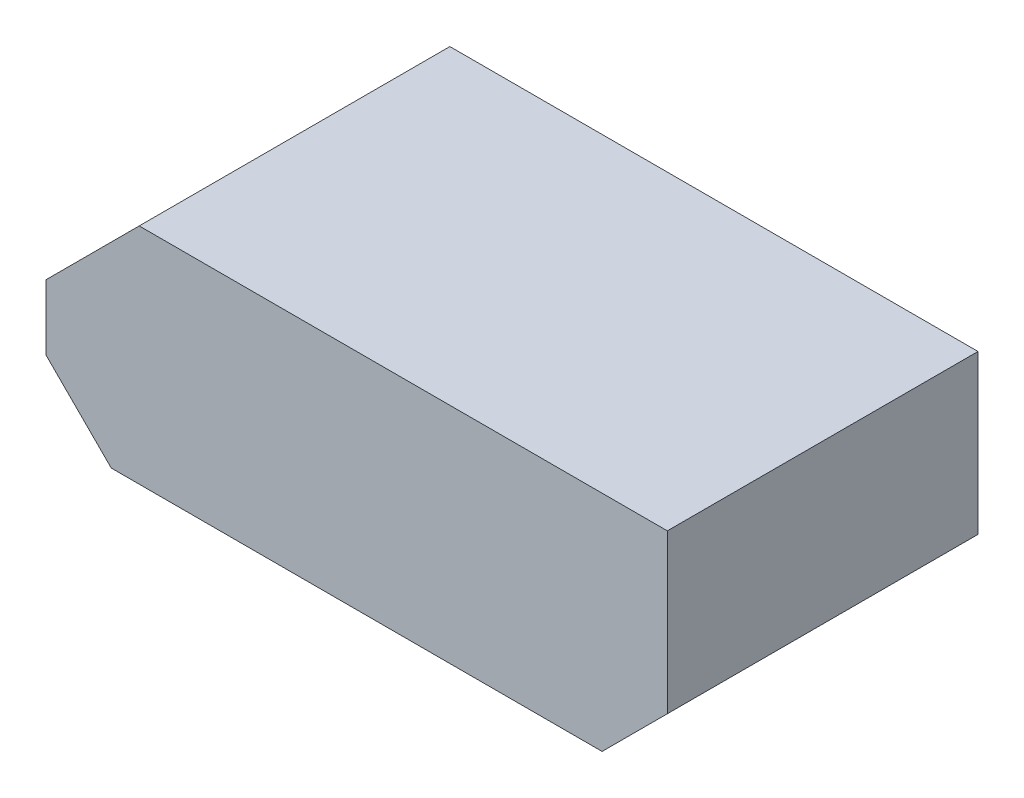
ISO-10303-21;
HEADER;
FILE_DESCRIPTION(('STEP AP214'),'2;1');
FILE_NAME('part.step','',(''),(''),'','','');
FILE_SCHEMA(('AUTOMOTIVE_DESIGN { 1 0 10303 214 1 1 1 1 }'));
ENDSEC;
DATA;
#1=APPLICATION_CONTEXT('core data for automotive mechanical design processes');
#2=APPLICATION_PROTOCOL_DEFINITION('international standard','automotive_design',2000,#1);
#3=PRODUCT_CONTEXT('',#1,'mechanical');
#4=PRODUCT('Part','Part','',(#3));
#5=PRODUCT_RELATED_PRODUCT_CATEGORY('part','',(#4));
#6=PRODUCT_DEFINITION_FORMATION('','',#4);
#7=PRODUCT_DEFINITION_CONTEXT('part definition',#1,'design');
#8=PRODUCT_DEFINITION('design','',#6,#7);
#9=PRODUCT_DEFINITION_SHAPE('','',#8);
#10=(LENGTH_UNIT() NAMED_UNIT(*) SI_UNIT(.MILLI.,.METRE.));
#11=(NAMED_UNIT(*) PLANE_ANGLE_UNIT() SI_UNIT($,.RADIAN.));
#12=(NAMED_UNIT(*) SI_UNIT($,.STERADIAN.) SOLID_ANGLE_UNIT());
#13=UNCERTAINTY_MEASURE_WITH_UNIT(LENGTH_MEASURE(1.E-05),#10,'distance_accuracy_value','');
#14=(GEOMETRIC_REPRESENTATION_CONTEXT(3) GLOBAL_UNCERTAINTY_ASSIGNED_CONTEXT((#13)) GLOBAL_UNIT_ASSIGNED_CONTEXT((#10,
#11,#12)) REPRESENTATION_CONTEXT('',''));
#15=CARTESIAN_POINT('',(0.,0.,0.));
#16=DIRECTION('',(0.,0.,1.));
#17=DIRECTION('',(1.,0.,0.));
#18=AXIS2_PLACEMENT_3D('',#15,#16,#17);
#19=CARTESIAN_POINT('',(628.969744525669,-699.597339454556,500.));
#20=DIRECTION('',(0.707106781186554,-0.707106781186541,0.));
#21=DIRECTION('',(0.707106781186541,0.707106781186554,0.));
#22=AXIS2_PLACEMENT_3D('',#19,#20,#21);
#23=PLANE('',#22);
#24=DIRECTION('',(-0.707106781186541,-0.707106781186554,0.));
#25=VECTOR('',#24,1.);
#26=CARTESIAN_POINT('',(628.969744525669,-699.597339454556,0.));
#27=LINE('',#26,#25);
#28=CARTESIAN_POINT('',(1254.88292822101,-73.6841557591998,0.));
#29=VERTEX_POINT('',#28);
#30=CARTESIAN_POINT('',(1149.88292822101,-178.6841557592,0.));
#31=VERTEX_POINT('',#30);
#32=EDGE_CURVE('E121',#29,#31,#27,.T.);
#33=ORIENTED_EDGE('',*,*,#32,.F.);
#34=DIRECTION('',(0.,0.,-1.));
#35=VECTOR('',#34,1.);
#36=CARTESIAN_POINT('',(1254.88292822101,-73.6841557591998,500.));
#37=LINE('',#36,#35);
#38=CARTESIAN_POINT('',(1254.88292822101,-73.6841557591998,500.));
#39=VERTEX_POINT('',#38);
#40=EDGE_CURVE('E11',#39,#29,#37,.T.);
#41=ORIENTED_EDGE('',*,*,#40,.F.);
#42=DIRECTION('',(-0.707106781186541,-0.707106781186554,0.));
#43=VECTOR('',#42,1.);
#44=CARTESIAN_POINT('',(628.969744525669,-699.597339454556,500.));
#45=LINE('',#44,#43);
#46=CARTESIAN_POINT('',(1149.88292822101,-178.6841557592,500.));
#47=VERTEX_POINT('',#46);
#48=EDGE_CURVE('E136',#39,#47,#45,.T.);
#49=ORIENTED_EDGE('',*,*,#48,.T.);
#50=DIRECTION('',(0.,0.,-1.));
#51=VECTOR('',#50,1.);
#52=CARTESIAN_POINT('',(1149.88292822101,-178.6841557592,500.));
#53=LINE('',#52,#51);
#54=EDGE_CURVE('E83',#47,#31,#53,.T.);
#55=ORIENTED_EDGE('',*,*,#54,.T.);
#56=EDGE_LOOP('',(#33,#41,#49,#55));
#57=FACE_BOUND('',#56,.T.);
#58=ADVANCED_FACE('F35',(#57),#23,.T.);
#59=CARTESIAN_POINT('',(1254.88292822101,-825.510523149898,500.));
#60=DIRECTION('',(-1.,0.,0.));
#61=DIRECTION('',(0.,0.,1.));
#62=AXIS2_PLACEMENT_3D('',#59,#60,#61);
#63=PLANE('',#62);
#64=DIRECTION('',(0.,1.,0.));
#65=VECTOR('',#64,1.);
#66=CARTESIAN_POINT('',(1254.88292822101,-825.510523149898,0.));
#67=LINE('',#66,#65);
#68=CARTESIAN_POINT('',(1254.88292822101,181.3158442408,0.));
#69=VERTEX_POINT('',#68);
#70=EDGE_CURVE('E124',#29,#69,#67,.T.);
#71=ORIENTED_EDGE('',*,*,#70,.T.);
#72=DIRECTION('',(0.,0.,-1.));
#73=VECTOR('',#72,1.);
#74=CARTESIAN_POINT('',(1254.88292822101,181.3158442408,500.));
#75=LINE('',#74,#73);
#76=CARTESIAN_POINT('',(1254.88292822101,181.3158442408,500.));
#77=VERTEX_POINT('',#76);
#78=EDGE_CURVE('E43',#77,#69,#75,.T.);
#79=ORIENTED_EDGE('',*,*,#78,.F.);
#80=DIRECTION('',(0.,1.,0.));
#81=VECTOR('',#80,1.);
#82=CARTESIAN_POINT('',(1254.88292822101,-825.510523149898,500.));
#83=LINE('',#82,#81);
#84=EDGE_CURVE('E156',#39,#77,#83,.T.);
#85=ORIENTED_EDGE('',*,*,#84,.F.);
#86=ORIENTED_EDGE('',*,*,#40,.T.);
#87=EDGE_LOOP('',(#71,#79,#85,#86));
#88=FACE_BOUND('',#87,.T.);
#89=ADVANCED_FACE('F160',(#88),#63,.F.);
#90=CARTESIAN_POINT('',(754.882928221013,181.3158442408,500.));
#91=DIRECTION('',(0.,-1.,0.));
#92=DIRECTION('',(1.,0.,0.));
#93=AXIS2_PLACEMENT_3D('',#90,#91,#92);
#94=PLANE('',#93);
#95=DIRECTION('',(-1.,0.,0.));
#96=VECTOR('',#95,1.);
#97=CARTESIAN_POINT('',(754.882928221013,181.3158442408,0.));
#98=LINE('',#97,#96);
#99=CARTESIAN_POINT('',(404.882928221013,181.3158442408,0.));
#100=VERTEX_POINT('',#99);
#101=EDGE_CURVE('E126',#69,#100,#98,.T.);
#102=ORIENTED_EDGE('',*,*,#101,.T.);
#103=DIRECTION('',(0.,0.,-1.));
#104=VECTOR('',#103,1.);
#105=CARTESIAN_POINT('',(404.882928221013,181.3158442408,500.));
#106=LINE('',#105,#104);
#107=CARTESIAN_POINT('',(404.882928221013,181.3158442408,500.));
#108=VERTEX_POINT('',#107);
#109=EDGE_CURVE('E140',#108,#100,#106,.T.);
#110=ORIENTED_EDGE('',*,*,#109,.F.);
#111=DIRECTION('',(-1.,0.,0.));
#112=VECTOR('',#111,1.);
#113=CARTESIAN_POINT('',(754.882928221013,181.3158442408,500.));
#114=LINE('',#113,#112);
#115=EDGE_CURVE('E148',#77,#108,#114,.T.);
#116=ORIENTED_EDGE('',*,*,#115,.F.);
#117=ORIENTED_EDGE('',*,*,#78,.T.);
#118=EDGE_LOOP('',(#102,#110,#116,#117));
#119=FACE_BOUND('',#118,.T.);
#120=ADVANCED_FACE('F146',(#119),#94,.F.);
#121=CARTESIAN_POINT('',(76.4697445256639,-147.097339454549,500.));
#122=DIRECTION('',(-0.707106781186548,0.707106781186547,0.));
#123=DIRECTION('',(-0.707106781186547,-0.707106781186548,0.));
#124=AXIS2_PLACEMENT_3D('',#121,#122,#123);
#125=PLANE('',#124);
#126=DIRECTION('',(0.707106781186547,0.707106781186548,0.));
#127=VECTOR('',#126,1.);
#128=CARTESIAN_POINT('',(76.4697445256639,-147.097339454549,0.));
#129=LINE('',#128,#127);
#130=CARTESIAN_POINT('',(254.882928221013,31.3158442408004,0.));
#131=VERTEX_POINT('',#130);
#132=EDGE_CURVE('E129',#131,#100,#129,.T.);
#133=ORIENTED_EDGE('',*,*,#132,.F.);
#134=DIRECTION('',(0.,0.,-1.));
#135=VECTOR('',#134,1.);
#136=CARTESIAN_POINT('',(254.882928221013,31.3158442408004,500.));
#137=LINE('',#136,#135);
#138=CARTESIAN_POINT('',(254.882928221013,31.3158442408004,500.));
#139=VERTEX_POINT('',#138);
#140=EDGE_CURVE('E113',#139,#131,#137,.T.);
#141=ORIENTED_EDGE('',*,*,#140,.F.);
#142=DIRECTION('',(0.707106781186547,0.707106781186548,0.));
#143=VECTOR('',#142,1.);
#144=CARTESIAN_POINT('',(76.4697445256639,-147.097339454549,500.));
#145=LINE('',#144,#143);
#146=EDGE_CURVE('E106',#139,#108,#145,.T.);
#147=ORIENTED_EDGE('',*,*,#146,.T.);
#148=ORIENTED_EDGE('',*,*,#109,.T.);
#149=EDGE_LOOP('',(#133,#141,#147,#148));
#150=FACE_BOUND('',#149,.T.);
#151=ADVANCED_FACE('F155',(#150),#125,.T.);
#152=CARTESIAN_POINT('',(254.882928221013,-825.510523149898,500.));
#153=DIRECTION('',(1.,0.,0.));
#154=DIRECTION('',(0.,0.,-1.));
#155=AXIS2_PLACEMENT_3D('',#152,#153,#154);
#156=PLANE('',#155);
#157=DIRECTION('',(0.,-1.,0.));
#158=VECTOR('',#157,1.);
#159=CARTESIAN_POINT('',(254.882928221013,-825.510523149898,0.));
#160=LINE('',#159,#158);
#161=CARTESIAN_POINT('',(254.882928221013,-73.6841557591998,0.));
#162=VERTEX_POINT('',#161);
#163=EDGE_CURVE('E112',#131,#162,#160,.T.);
#164=ORIENTED_EDGE('',*,*,#163,.T.);
#165=DIRECTION('',(0.,0.,-1.));
#166=VECTOR('',#165,1.);
#167=CARTESIAN_POINT('',(254.882928221013,-73.6841557591998,500.));
#168=LINE('',#167,#166);
#169=CARTESIAN_POINT('',(254.882928221013,-73.6841557591998,500.));
#170=VERTEX_POINT('',#169);
#171=EDGE_CURVE('E109',#170,#162,#168,.T.);
#172=ORIENTED_EDGE('',*,*,#171,.F.);
#173=DIRECTION('',(0.,-1.,0.));
#174=VECTOR('',#173,1.);
#175=CARTESIAN_POINT('',(254.882928221013,-825.510523149898,500.));
#176=LINE('',#175,#174);
#177=EDGE_CURVE('E100',#139,#170,#176,.T.);
#178=ORIENTED_EDGE('',*,*,#177,.F.);
#179=ORIENTED_EDGE('',*,*,#140,.T.);
#180=EDGE_LOOP('',(#164,#172,#178,#179));
#181=FACE_BOUND('',#180,.T.);
#182=ADVANCED_FACE('F110',(#181),#156,.F.);
#183=CARTESIAN_POINT('',(880.796111916363,-699.597339454549,500.));
#184=DIRECTION('',(0.707106781186547,0.707106781186548,0.));
#185=DIRECTION('',(-0.707106781186548,0.707106781186547,0.));
#186=AXIS2_PLACEMENT_3D('',#183,#184,#185);
#187=PLANE('',#186);
#188=DIRECTION('',(0.707106781186548,-0.707106781186547,0.));
#189=VECTOR('',#188,1.);
#190=CARTESIAN_POINT('',(880.796111916363,-699.597339454549,0.));
#191=LINE('',#190,#189);
#192=CARTESIAN_POINT('',(359.882928221013,-178.6841557592,0.));
#193=VERTEX_POINT('',#192);
#194=EDGE_CURVE('E76',#162,#193,#191,.T.);
#195=ORIENTED_EDGE('',*,*,#194,.T.);
#196=DIRECTION('',(0.,0.,-1.));
#197=VECTOR('',#196,1.);
#198=CARTESIAN_POINT('',(359.882928221013,-178.6841557592,500.));
#199=LINE('',#198,#197);
#200=CARTESIAN_POINT('',(359.882928221013,-178.6841557592,500.));
#201=VERTEX_POINT('',#200);
#202=EDGE_CURVE('E114',#201,#193,#199,.T.);
#203=ORIENTED_EDGE('',*,*,#202,.F.);
#204=DIRECTION('',(0.707106781186548,-0.707106781186547,0.));
#205=VECTOR('',#204,1.);
#206=CARTESIAN_POINT('',(880.796111916363,-699.597339454549,500.));
#207=LINE('',#206,#205);
#208=EDGE_CURVE('E104',#170,#201,#207,.T.);
#209=ORIENTED_EDGE('',*,*,#208,.F.);
#210=ORIENTED_EDGE('',*,*,#171,.T.);
#211=EDGE_LOOP('',(#195,#203,#209,#210));
#212=FACE_BOUND('',#211,.T.);
#213=ADVANCED_FACE('F116',(#212),#187,.F.);
#214=CARTESIAN_POINT('',(754.882928221013,-178.6841557592,500.));
#215=DIRECTION('',(0.,1.,0.));
#216=DIRECTION('',(0.,0.,1.));
#217=AXIS2_PLACEMENT_3D('',#214,#215,#216);
#218=PLANE('',#217);
#219=DIRECTION('',(1.,0.,0.));
#220=VECTOR('',#219,1.);
#221=CARTESIAN_POINT('',(754.882928221013,-178.6841557592,0.));
#222=LINE('',#221,#220);
#223=EDGE_CURVE('E134',#193,#31,#222,.T.);
#224=ORIENTED_EDGE('',*,*,#223,.T.);
#225=ORIENTED_EDGE('',*,*,#54,.F.);
#226=DIRECTION('',(1.,0.,0.));
#227=VECTOR('',#226,1.);
#228=CARTESIAN_POINT('',(754.882928221013,-178.6841557592,500.));
#229=LINE('',#228,#227);
#230=EDGE_CURVE('E51',#201,#47,#229,.T.);
#231=ORIENTED_EDGE('',*,*,#230,.F.);
#232=ORIENTED_EDGE('',*,*,#202,.T.);
#233=EDGE_LOOP('',(#224,#225,#231,#232));
#234=FACE_BOUND('',#233,.T.);
#235=ADVANCED_FACE('F174',(#234),#218,.F.);
#236=CARTESIAN_POINT('',(754.882928221013,-825.510523149898,500.));
#237=DIRECTION('',(0.,0.,1.));
#238=DIRECTION('',(1.,0.,0.));
#239=AXIS2_PLACEMENT_3D('',#236,#237,#238);
#240=PLANE('',#239);
#241=ORIENTED_EDGE('',*,*,#48,.F.);
#242=ORIENTED_EDGE('',*,*,#84,.T.);
#243=ORIENTED_EDGE('',*,*,#115,.T.);
#244=ORIENTED_EDGE('',*,*,#146,.F.);
#245=ORIENTED_EDGE('',*,*,#177,.T.);
#246=ORIENTED_EDGE('',*,*,#208,.T.);
#247=ORIENTED_EDGE('',*,*,#230,.T.);
#248=EDGE_LOOP('',(#241,#242,#243,#244,#245,#246,#247));
#249=FACE_BOUND('',#248,.T.);
#250=ADVANCED_FACE('F102',(#249),#240,.T.);
#251=CARTESIAN_POINT('',(754.882928221013,-825.510523149898,0.));
#252=DIRECTION('',(0.,0.,1.));
#253=DIRECTION('',(1.,0.,0.));
#254=AXIS2_PLACEMENT_3D('',#251,#252,#253);
#255=PLANE('',#254);
#256=ORIENTED_EDGE('',*,*,#32,.T.);
#257=ORIENTED_EDGE('',*,*,#223,.F.);
#258=ORIENTED_EDGE('',*,*,#194,.F.);
#259=ORIENTED_EDGE('',*,*,#163,.F.);
#260=ORIENTED_EDGE('',*,*,#132,.T.);
#261=ORIENTED_EDGE('',*,*,#101,.F.);
#262=ORIENTED_EDGE('',*,*,#70,.F.);
#263=EDGE_LOOP('',(#256,#257,#258,#259,#260,#261,#262));
#264=FACE_BOUND('',#263,.T.);
#265=ADVANCED_FACE('F152',(#264),#255,.F.);
#266=CLOSED_SHELL('',(#58,#89,#120,#151,#182,#213,#235,#250,#265));
#267=MANIFOLD_SOLID_BREP('B2',#266);
#268=ADVANCED_BREP_SHAPE_REPRESENTATION('',(#18,#267),#14);
#269=SHAPE_DEFINITION_REPRESENTATION(#9,#268);
ENDSEC;
END-ISO-10303-21;
